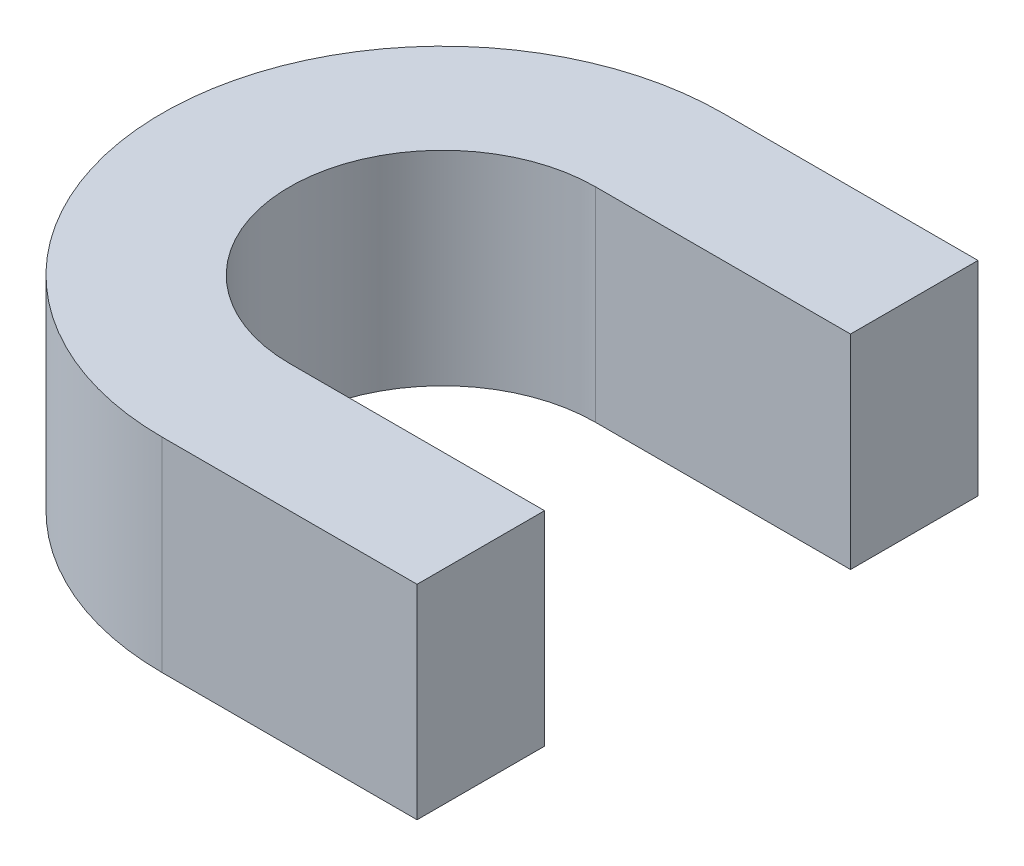
ISO-10303-21;
HEADER;
FILE_DESCRIPTION(('STEP AP214'),'2;1');
FILE_NAME('part.step','',(''),(''),'','','');
FILE_SCHEMA(('AUTOMOTIVE_DESIGN { 1 0 10303 214 1 1 1 1 }'));
ENDSEC;
DATA;
#1=APPLICATION_CONTEXT('core data for automotive mechanical design processes');
#2=APPLICATION_PROTOCOL_DEFINITION('international standard','automotive_design',2000,#1);
#3=PRODUCT_CONTEXT('',#1,'mechanical');
#4=PRODUCT('Part','Part','',(#3));
#5=PRODUCT_RELATED_PRODUCT_CATEGORY('part','',(#4));
#6=PRODUCT_DEFINITION_FORMATION('','',#4);
#7=PRODUCT_DEFINITION_CONTEXT('part definition',#1,'design');
#8=PRODUCT_DEFINITION('design','',#6,#7);
#9=PRODUCT_DEFINITION_SHAPE('','',#8);
#10=(LENGTH_UNIT() NAMED_UNIT(*) SI_UNIT(.MILLI.,.METRE.));
#11=(NAMED_UNIT(*) PLANE_ANGLE_UNIT() SI_UNIT($,.RADIAN.));
#12=(NAMED_UNIT(*) SI_UNIT($,.STERADIAN.) SOLID_ANGLE_UNIT());
#13=UNCERTAINTY_MEASURE_WITH_UNIT(LENGTH_MEASURE(1.E-05),#10,'distance_accuracy_value','');
#14=(GEOMETRIC_REPRESENTATION_CONTEXT(3) GLOBAL_UNCERTAINTY_ASSIGNED_CONTEXT((#13)) GLOBAL_UNIT_ASSIGNED_CONTEXT((#10,
#11,#12)) REPRESENTATION_CONTEXT('',''));
#15=CARTESIAN_POINT('',(0.,0.,0.));
#16=DIRECTION('',(0.,0.,1.));
#17=DIRECTION('',(1.,0.,0.));
#18=AXIS2_PLACEMENT_3D('',#15,#16,#17);
#19=CARTESIAN_POINT('',(0.,8.,0.));
#20=DIRECTION('',(0.,-1.,0.));
#21=DIRECTION('',(0.,0.,-1.));
#22=AXIS2_PLACEMENT_3D('',#19,#20,#21);
#23=CYLINDRICAL_SURFACE('',#22,11.);
#24=CARTESIAN_POINT('',(0.,0.,0.));
#25=DIRECTION('',(0.,1.,0.));
#26=DIRECTION('',(0.,0.,1.));
#27=AXIS2_PLACEMENT_3D('',#24,#25,#26);
#28=CIRCLE('',#27,11.);
#29=CARTESIAN_POINT('',(0.,0.,-11.));
#30=VERTEX_POINT('',#29);
#31=CARTESIAN_POINT('',(0.,0.,11.));
#32=VERTEX_POINT('',#31);
#33=EDGE_CURVE('E144',#30,#32,#28,.T.);
#34=ORIENTED_EDGE('',*,*,#33,.T.);
#35=DIRECTION('',(0.,-1.,0.));
#36=VECTOR('',#35,1.);
#37=CARTESIAN_POINT('',(0.,8.,11.));
#38=LINE('',#37,#36);
#39=CARTESIAN_POINT('',(0.,8.,11.));
#40=VERTEX_POINT('',#39);
#41=EDGE_CURVE('E11',#40,#32,#38,.T.);
#42=ORIENTED_EDGE('',*,*,#41,.F.);
#43=CARTESIAN_POINT('',(0.,8.,0.));
#44=DIRECTION('',(0.,1.,0.));
#45=DIRECTION('',(0.,0.,1.));
#46=AXIS2_PLACEMENT_3D('',#43,#44,#45);
#47=CIRCLE('',#46,11.);
#48=CARTESIAN_POINT('',(0.,8.,-11.));
#49=VERTEX_POINT('',#48);
#50=EDGE_CURVE('E166',#49,#40,#47,.T.);
#51=ORIENTED_EDGE('',*,*,#50,.F.);
#52=DIRECTION('',(0.,-1.,0.));
#53=VECTOR('',#52,1.);
#54=CARTESIAN_POINT('',(0.,8.,-11.));
#55=LINE('',#54,#53);
#56=EDGE_CURVE('E140',#49,#30,#55,.T.);
#57=ORIENTED_EDGE('',*,*,#56,.T.);
#58=EDGE_LOOP('',(#34,#42,#51,#57));
#59=FACE_BOUND('',#58,.T.);
#60=ADVANCED_FACE('F43',(#59),#23,.T.);
#61=CARTESIAN_POINT('',(10.,8.,11.));
#62=DIRECTION('',(0.,0.,-1.));
#63=DIRECTION('',(-1.,0.,0.));
#64=AXIS2_PLACEMENT_3D('',#61,#62,#63);
#65=PLANE('',#64);
#66=DIRECTION('',(1.,0.,0.));
#67=VECTOR('',#66,1.);
#68=CARTESIAN_POINT('',(10.,0.,11.));
#69=LINE('',#68,#67);
#70=CARTESIAN_POINT('',(10.,0.,11.));
#71=VERTEX_POINT('',#70);
#72=EDGE_CURVE('E148',#32,#71,#69,.T.);
#73=ORIENTED_EDGE('',*,*,#72,.T.);
#74=DIRECTION('',(0.,-1.,0.));
#75=VECTOR('',#74,1.);
#76=CARTESIAN_POINT('',(10.,8.,11.));
#77=LINE('',#76,#75);
#78=CARTESIAN_POINT('',(10.,8.,11.));
#79=VERTEX_POINT('',#78);
#80=EDGE_CURVE('E52',#79,#71,#77,.T.);
#81=ORIENTED_EDGE('',*,*,#80,.F.);
#82=DIRECTION('',(1.,0.,0.));
#83=VECTOR('',#82,1.);
#84=CARTESIAN_POINT('',(10.,8.,11.));
#85=LINE('',#84,#83);
#86=EDGE_CURVE('E103',#40,#79,#85,.T.);
#87=ORIENTED_EDGE('',*,*,#86,.F.);
#88=ORIENTED_EDGE('',*,*,#41,.T.);
#89=EDGE_LOOP('',(#73,#81,#87,#88));
#90=FACE_BOUND('',#89,.T.);
#91=ADVANCED_FACE('F212',(#90),#65,.F.);
#92=CARTESIAN_POINT('',(10.,8.,6.));
#93=DIRECTION('',(-1.,0.,0.));
#94=DIRECTION('',(0.,0.,1.));
#95=AXIS2_PLACEMENT_3D('',#92,#93,#94);
#96=PLANE('',#95);
#97=DIRECTION('',(0.,0.,-1.));
#98=VECTOR('',#97,1.);
#99=CARTESIAN_POINT('',(10.,0.,6.));
#100=LINE('',#99,#98);
#101=CARTESIAN_POINT('',(10.,0.,6.));
#102=VERTEX_POINT('',#101);
#103=EDGE_CURVE('E151',#71,#102,#100,.T.);
#104=ORIENTED_EDGE('',*,*,#103,.T.);
#105=DIRECTION('',(0.,-1.,0.));
#106=VECTOR('',#105,1.);
#107=CARTESIAN_POINT('',(10.,8.,6.));
#108=LINE('',#107,#106);
#109=CARTESIAN_POINT('',(10.,8.,6.));
#110=VERTEX_POINT('',#109);
#111=EDGE_CURVE('E177',#110,#102,#108,.T.);
#112=ORIENTED_EDGE('',*,*,#111,.F.);
#113=DIRECTION('',(0.,0.,-1.));
#114=VECTOR('',#113,1.);
#115=CARTESIAN_POINT('',(10.,8.,6.));
#116=LINE('',#115,#114);
#117=EDGE_CURVE('E187',#79,#110,#116,.T.);
#118=ORIENTED_EDGE('',*,*,#117,.F.);
#119=ORIENTED_EDGE('',*,*,#80,.T.);
#120=EDGE_LOOP('',(#104,#112,#118,#119));
#121=FACE_BOUND('',#120,.T.);
#122=ADVANCED_FACE('F185',(#121),#96,.F.);
#123=CARTESIAN_POINT('',(0.,8.,5.99999999999999));
#124=DIRECTION('',(0.,0.,1.));
#125=DIRECTION('',(1.,0.,0.));
#126=AXIS2_PLACEMENT_3D('',#123,#124,#125);
#127=PLANE('',#126);
#128=DIRECTION('',(-1.,0.,0.));
#129=VECTOR('',#128,1.);
#130=CARTESIAN_POINT('',(0.,0.,5.99999999999999));
#131=LINE('',#130,#129);
#132=CARTESIAN_POINT('',(0.,0.,5.99999999999999));
#133=VERTEX_POINT('',#132);
#134=EDGE_CURVE('E154',#102,#133,#131,.T.);
#135=ORIENTED_EDGE('',*,*,#134,.T.);
#136=DIRECTION('',(0.,-1.,0.));
#137=VECTOR('',#136,1.);
#138=CARTESIAN_POINT('',(0.,8.,5.99999999999999));
#139=LINE('',#138,#137);
#140=CARTESIAN_POINT('',(0.,8.,5.99999999999999));
#141=VERTEX_POINT('',#140);
#142=EDGE_CURVE('E173',#141,#133,#139,.T.);
#143=ORIENTED_EDGE('',*,*,#142,.F.);
#144=DIRECTION('',(-1.,0.,0.));
#145=VECTOR('',#144,1.);
#146=CARTESIAN_POINT('',(0.,8.,5.99999999999999));
#147=LINE('',#146,#145);
#148=EDGE_CURVE('E200',#110,#141,#147,.T.);
#149=ORIENTED_EDGE('',*,*,#148,.F.);
#150=ORIENTED_EDGE('',*,*,#111,.T.);
#151=EDGE_LOOP('',(#135,#143,#149,#150));
#152=FACE_BOUND('',#151,.T.);
#153=ADVANCED_FACE('F195',(#152),#127,.F.);
#154=CARTESIAN_POINT('',(0.,8.,0.));
#155=DIRECTION('',(0.,-1.,0.));
#156=DIRECTION('',(0.,0.,-1.));
#157=AXIS2_PLACEMENT_3D('',#154,#155,#156);
#158=CYLINDRICAL_SURFACE('',#157,5.99999999999999);
#159=CARTESIAN_POINT('',(0.,0.,0.));
#160=DIRECTION('',(0.,-1.,0.));
#161=DIRECTION('',(0.,0.,1.));
#162=AXIS2_PLACEMENT_3D('',#159,#160,#161);
#163=CIRCLE('',#162,5.99999999999999);
#164=CARTESIAN_POINT('',(0.,0.,-5.99999999999999));
#165=VERTEX_POINT('',#164);
#166=EDGE_CURVE('E157',#133,#165,#163,.T.);
#167=ORIENTED_EDGE('',*,*,#166,.T.);
#168=DIRECTION('',(0.,-1.,0.));
#169=VECTOR('',#168,1.);
#170=CARTESIAN_POINT('',(0.,8.,-5.99999999999999));
#171=LINE('',#170,#169);
#172=CARTESIAN_POINT('',(0.,8.,-5.99999999999999));
#173=VERTEX_POINT('',#172);
#174=EDGE_CURVE('E133',#173,#165,#171,.T.);
#175=ORIENTED_EDGE('',*,*,#174,.F.);
#176=CARTESIAN_POINT('',(0.,8.,0.));
#177=DIRECTION('',(0.,-1.,0.));
#178=DIRECTION('',(0.,0.,1.));
#179=AXIS2_PLACEMENT_3D('',#176,#177,#178);
#180=CIRCLE('',#179,5.99999999999999);
#181=EDGE_CURVE('E122',#141,#173,#180,.T.);
#182=ORIENTED_EDGE('',*,*,#181,.F.);
#183=ORIENTED_EDGE('',*,*,#142,.T.);
#184=EDGE_LOOP('',(#167,#175,#182,#183));
#185=FACE_BOUND('',#184,.T.);
#186=ADVANCED_FACE('F198',(#185),#158,.F.);
#187=CARTESIAN_POINT('',(10.,8.,-6.));
#188=DIRECTION('',(0.,0.,-1.));
#189=DIRECTION('',(-1.,0.,0.));
#190=AXIS2_PLACEMENT_3D('',#187,#188,#189);
#191=PLANE('',#190);
#192=DIRECTION('',(1.,0.,0.));
#193=VECTOR('',#192,1.);
#194=CARTESIAN_POINT('',(10.,0.,-6.));
#195=LINE('',#194,#193);
#196=CARTESIAN_POINT('',(10.,0.,-6.));
#197=VERTEX_POINT('',#196);
#198=EDGE_CURVE('E131',#165,#197,#195,.T.);
#199=ORIENTED_EDGE('',*,*,#198,.T.);
#200=DIRECTION('',(0.,-1.,0.));
#201=VECTOR('',#200,1.);
#202=CARTESIAN_POINT('',(10.,8.,-6.));
#203=LINE('',#202,#201);
#204=CARTESIAN_POINT('',(10.,8.,-6.));
#205=VERTEX_POINT('',#204);
#206=EDGE_CURVE('E128',#205,#197,#203,.T.);
#207=ORIENTED_EDGE('',*,*,#206,.F.);
#208=DIRECTION('',(1.,0.,0.));
#209=VECTOR('',#208,1.);
#210=CARTESIAN_POINT('',(10.,8.,-6.));
#211=LINE('',#210,#209);
#212=EDGE_CURVE('E116',#173,#205,#211,.T.);
#213=ORIENTED_EDGE('',*,*,#212,.F.);
#214=ORIENTED_EDGE('',*,*,#174,.T.);
#215=EDGE_LOOP('',(#199,#207,#213,#214));
#216=FACE_BOUND('',#215,.T.);
#217=ADVANCED_FACE('F129',(#216),#191,.F.);
#218=CARTESIAN_POINT('',(10.,8.,-11.));
#219=DIRECTION('',(-1.,0.,0.));
#220=DIRECTION('',(0.,0.,1.));
#221=AXIS2_PLACEMENT_3D('',#218,#219,#220);
#222=PLANE('',#221);
#223=DIRECTION('',(0.,0.,-1.));
#224=VECTOR('',#223,1.);
#225=CARTESIAN_POINT('',(10.,0.,-11.));
#226=LINE('',#225,#224);
#227=CARTESIAN_POINT('',(10.,0.,-11.));
#228=VERTEX_POINT('',#227);
#229=EDGE_CURVE('E89',#197,#228,#226,.T.);
#230=ORIENTED_EDGE('',*,*,#229,.T.);
#231=DIRECTION('',(0.,-1.,0.));
#232=VECTOR('',#231,1.);
#233=CARTESIAN_POINT('',(10.,8.,-11.));
#234=LINE('',#233,#232);
#235=CARTESIAN_POINT('',(10.,8.,-11.));
#236=VERTEX_POINT('',#235);
#237=EDGE_CURVE('E134',#236,#228,#234,.T.);
#238=ORIENTED_EDGE('',*,*,#237,.F.);
#239=DIRECTION('',(0.,0.,-1.));
#240=VECTOR('',#239,1.);
#241=CARTESIAN_POINT('',(10.,8.,-11.));
#242=LINE('',#241,#240);
#243=EDGE_CURVE('E120',#205,#236,#242,.T.);
#244=ORIENTED_EDGE('',*,*,#243,.F.);
#245=ORIENTED_EDGE('',*,*,#206,.T.);
#246=EDGE_LOOP('',(#230,#238,#244,#245));
#247=FACE_BOUND('',#246,.T.);
#248=ADVANCED_FACE('F136',(#247),#222,.F.);
#249=CARTESIAN_POINT('',(0.,8.,-11.));
#250=DIRECTION('',(0.,0.,1.));
#251=DIRECTION('',(1.,0.,0.));
#252=AXIS2_PLACEMENT_3D('',#249,#250,#251);
#253=PLANE('',#252);
#254=DIRECTION('',(-1.,0.,0.));
#255=VECTOR('',#254,1.);
#256=CARTESIAN_POINT('',(0.,0.,-11.));
#257=LINE('',#256,#255);
#258=EDGE_CURVE('E95',#228,#30,#257,.T.);
#259=ORIENTED_EDGE('',*,*,#258,.T.);
#260=ORIENTED_EDGE('',*,*,#56,.F.);
#261=DIRECTION('',(-1.,0.,0.));
#262=VECTOR('',#261,1.);
#263=CARTESIAN_POINT('',(0.,8.,-11.));
#264=LINE('',#263,#262);
#265=EDGE_CURVE('E60',#236,#49,#264,.T.);
#266=ORIENTED_EDGE('',*,*,#265,.F.);
#267=ORIENTED_EDGE('',*,*,#237,.T.);
#268=EDGE_LOOP('',(#259,#260,#266,#267));
#269=FACE_BOUND('',#268,.T.);
#270=ADVANCED_FACE('F228',(#269),#253,.F.);
#271=CARTESIAN_POINT('',(0.,8.,0.));
#272=DIRECTION('',(0.,1.,0.));
#273=DIRECTION('',(0.,0.,1.));
#274=AXIS2_PLACEMENT_3D('',#271,#272,#273);
#275=PLANE('',#274);
#276=ORIENTED_EDGE('',*,*,#50,.T.);
#277=ORIENTED_EDGE('',*,*,#86,.T.);
#278=ORIENTED_EDGE('',*,*,#117,.T.);
#279=ORIENTED_EDGE('',*,*,#148,.T.);
#280=ORIENTED_EDGE('',*,*,#181,.T.);
#281=ORIENTED_EDGE('',*,*,#212,.T.);
#282=ORIENTED_EDGE('',*,*,#243,.T.);
#283=ORIENTED_EDGE('',*,*,#265,.T.);
#284=EDGE_LOOP('',(#276,#277,#278,#279,#280,#281,#282,#283));
#285=FACE_BOUND('',#284,.T.);
#286=ADVANCED_FACE('F118',(#285),#275,.T.);
#287=CARTESIAN_POINT('',(0.,0.,0.));
#288=DIRECTION('',(0.,1.,0.));
#289=DIRECTION('',(0.,0.,1.));
#290=AXIS2_PLACEMENT_3D('',#287,#288,#289);
#291=PLANE('',#290);
#292=ORIENTED_EDGE('',*,*,#33,.F.);
#293=ORIENTED_EDGE('',*,*,#258,.F.);
#294=ORIENTED_EDGE('',*,*,#229,.F.);
#295=ORIENTED_EDGE('',*,*,#198,.F.);
#296=ORIENTED_EDGE('',*,*,#166,.F.);
#297=ORIENTED_EDGE('',*,*,#134,.F.);
#298=ORIENTED_EDGE('',*,*,#103,.F.);
#299=ORIENTED_EDGE('',*,*,#72,.F.);
#300=EDGE_LOOP('',(#292,#293,#294,#295,#296,#297,#298,#299));
#301=FACE_BOUND('',#300,.T.);
#302=ADVANCED_FACE('F191',(#301),#291,.F.);
#303=CLOSED_SHELL('',(#60,#91,#122,#153,#186,#217,#248,#270,#286,#302));
#304=MANIFOLD_SOLID_BREP('B2',#303);
#305=ADVANCED_BREP_SHAPE_REPRESENTATION('',(#18,#304),#14);
#306=SHAPE_DEFINITION_REPRESENTATION(#9,#305);
ENDSEC;
END-ISO-10303-21;
